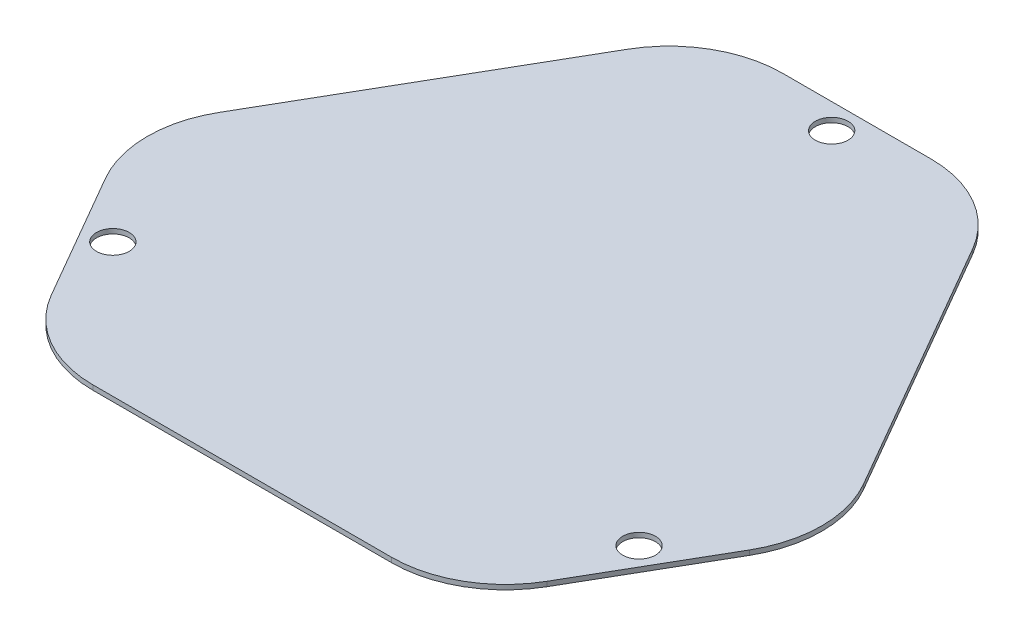
ISO-10303-21;
HEADER;
FILE_DESCRIPTION(('STEP AP214'),'2;1');
FILE_NAME('part.step','',(''),(''),'','','');
FILE_SCHEMA(('AUTOMOTIVE_DESIGN { 1 0 10303 214 1 1 1 1 }'));
ENDSEC;
DATA;
#1=APPLICATION_CONTEXT('core data for automotive mechanical design processes');
#2=APPLICATION_PROTOCOL_DEFINITION('international standard','automotive_design',2000,#1);
#3=PRODUCT_CONTEXT('',#1,'mechanical');
#4=PRODUCT('Part','Part','',(#3));
#5=PRODUCT_RELATED_PRODUCT_CATEGORY('part','',(#4));
#6=PRODUCT_DEFINITION_FORMATION('','',#4);
#7=PRODUCT_DEFINITION_CONTEXT('part definition',#1,'design');
#8=PRODUCT_DEFINITION('design','',#6,#7);
#9=PRODUCT_DEFINITION_SHAPE('','',#8);
#10=(LENGTH_UNIT() NAMED_UNIT(*) SI_UNIT(.MILLI.,.METRE.));
#11=(NAMED_UNIT(*) PLANE_ANGLE_UNIT() SI_UNIT($,.RADIAN.));
#12=(NAMED_UNIT(*) SI_UNIT($,.STERADIAN.) SOLID_ANGLE_UNIT());
#13=UNCERTAINTY_MEASURE_WITH_UNIT(LENGTH_MEASURE(1.E-05),#10,'distance_accuracy_value','');
#14=(GEOMETRIC_REPRESENTATION_CONTEXT(3) GLOBAL_UNCERTAINTY_ASSIGNED_CONTEXT((#13)) GLOBAL_UNIT_ASSIGNED_CONTEXT((#10,
#11,#12)) REPRESENTATION_CONTEXT('',''));
#15=CARTESIAN_POINT('',(0.,0.,0.));
#16=DIRECTION('',(0.,0.,1.));
#17=DIRECTION('',(1.,0.,0.));
#18=AXIS2_PLACEMENT_3D('',#15,#16,#17);
#19=CARTESIAN_POINT('',(0.,6.35,0.));
#20=DIRECTION('',(0.,1.,0.));
#21=DIRECTION('',(0.,0.,1.));
#22=AXIS2_PLACEMENT_3D('',#19,#20,#21);
#23=PLANE('',#22);
#24=CARTESIAN_POINT('',(-2.22133814389154E-13,6.35,-407.190237675492));
#25=DIRECTION('',(0.,1.,0.));
#26=DIRECTION('',(0.,0.,1.));
#27=AXIS2_PLACEMENT_3D('',#24,#25,#26);
#28=CIRCLE('',#27,21.971);
#29=CARTESIAN_POINT('',(-2.22133814389154E-13,6.35,-385.219237675492));
#30=VERTEX_POINT('',#29);
#31=EDGE_CURVE('E388',#30,#30,#28,.T.);
#32=ORIENTED_EDGE('',*,*,#31,.F.);
#33=EDGE_LOOP('',(#32));
#34=FACE_BOUND('',#33,.T.);
#35=CARTESIAN_POINT('',(352.63709,6.35,203.595118837746));
#36=DIRECTION('',(0.,1.,0.));
#37=DIRECTION('',(0.,0.,1.));
#38=AXIS2_PLACEMENT_3D('',#35,#36,#37);
#39=CIRCLE('',#38,21.971);
#40=CARTESIAN_POINT('',(352.63709,6.35,225.566118837746));
#41=VERTEX_POINT('',#40);
#42=EDGE_CURVE('E393',#41,#41,#39,.T.);
#43=ORIENTED_EDGE('',*,*,#42,.F.);
#44=EDGE_LOOP('',(#43));
#45=FACE_BOUND('',#44,.T.);
#46=CARTESIAN_POINT('',(-352.63709,6.35,203.595118837746));
#47=DIRECTION('',(0.,1.,0.));
#48=DIRECTION('',(0.,0.,1.));
#49=AXIS2_PLACEMENT_3D('',#46,#47,#48);
#50=CIRCLE('',#49,21.971);
#51=CARTESIAN_POINT('',(-352.63709,6.35,225.566118837746));
#52=VERTEX_POINT('',#51);
#53=EDGE_CURVE('E402',#52,#52,#50,.T.);
#54=ORIENTED_EDGE('',*,*,#53,.F.);
#55=EDGE_LOOP('',(#54));
#56=FACE_BOUND('',#55,.T.);
#57=DIRECTION('',(0.5,0.,-0.866025403784439));
#58=VECTOR('',#57,1.);
#59=CARTESIAN_POINT('',(229.493160190646,6.35,484.450661911243));
#60=LINE('',#59,#58);
#61=CARTESIAN_POINT('',(332.146038052562,6.35,306.650661911243));
#62=VERTEX_POINT('',#61);
#63=CARTESIAN_POINT('',(431.640282328731,6.35,134.32157576425));
#64=VERTEX_POINT('',#63);
#65=EDGE_CURVE('E134',#62,#64,#60,.T.);
#66=ORIENTED_EDGE('',*,*,#65,.T.);
#67=CARTESIAN_POINT('',(299.658010791982,6.35,58.1215757642498));
#68=DIRECTION('',(0.,1.,0.));
#69=DIRECTION('',(0.,0.,1.));
#70=AXIS2_PLACEMENT_3D('',#67,#68,#69);
#71=CIRCLE('',#70,152.4);
#72=CARTESIAN_POINT('',(431.640282328731,6.35,-18.0784242357502));
#73=VERTEX_POINT('',#72);
#74=EDGE_CURVE('E174',#64,#73,#71,.T.);
#75=ORIENTED_EDGE('',*,*,#74,.T.);
#76=DIRECTION('',(0.5,0.,0.866025403784439));
#77=VECTOR('',#76,1.);
#78=CARTESIAN_POINT('',(475.63437284098,6.35,58.1215757642498));
#79=LINE('',#78,#77);
#80=CARTESIAN_POINT('',(231.476515812917,6.35,-364.772237675493));
#81=VERTEX_POINT('',#80);
#82=EDGE_CURVE('E213',#81,#73,#79,.T.);
#83=ORIENTED_EDGE('',*,*,#82,.F.);
#84=CARTESIAN_POINT('',(99.4942442761689,6.35,-288.572237675493));
#85=DIRECTION('',(0.,1.,0.));
#86=DIRECTION('',(0.,0.,1.));
#87=AXIS2_PLACEMENT_3D('',#84,#85,#86);
#88=CIRCLE('',#87,152.4);
#89=CARTESIAN_POINT('',(99.4942442761689,6.35,-440.972237675493));
#90=VERTEX_POINT('',#89);
#91=EDGE_CURVE('E172',#81,#90,#88,.T.);
#92=ORIENTED_EDGE('',*,*,#91,.T.);
#93=DIRECTION('',(-1.,0.,0.));
#94=VECTOR('',#93,1.);
#95=CARTESIAN_POINT('',(304.8,6.35,-440.972237675493));
#96=LINE('',#95,#94);
#97=CARTESIAN_POINT('',(-99.4942442761688,6.35,-440.972237675493));
#98=VERTEX_POINT('',#97);
#99=EDGE_CURVE('E153',#90,#98,#96,.T.);
#100=ORIENTED_EDGE('',*,*,#99,.T.);
#101=CARTESIAN_POINT('',(-99.4942442761688,6.35,-288.572237675493));
#102=DIRECTION('',(0.,1.,0.));
#103=DIRECTION('',(0.,0.,1.));
#104=AXIS2_PLACEMENT_3D('',#101,#102,#103);
#105=CIRCLE('',#104,152.4);
#106=CARTESIAN_POINT('',(-231.476515812917,6.35,-364.772237675493));
#107=VERTEX_POINT('',#106);
#108=EDGE_CURVE('E170',#98,#107,#105,.T.);
#109=ORIENTED_EDGE('',*,*,#108,.T.);
#110=DIRECTION('',(0.5,0.,-0.866025403784439));
#111=VECTOR('',#110,1.);
#112=CARTESIAN_POINT('',(-187.482425300668,6.35,-440.972237675493));
#113=LINE('',#112,#111);
#114=CARTESIAN_POINT('',(-431.640282328731,6.35,-18.0784242357502));
#115=VERTEX_POINT('',#114);
#116=EDGE_CURVE('E225',#115,#107,#113,.T.);
#117=ORIENTED_EDGE('',*,*,#116,.F.);
#118=CARTESIAN_POINT('',(-299.658010791982,6.35,58.1215757642498));
#119=DIRECTION('',(0.,1.,0.));
#120=DIRECTION('',(0.,0.,1.));
#121=AXIS2_PLACEMENT_3D('',#118,#119,#120);
#122=CIRCLE('',#121,152.4);
#123=CARTESIAN_POINT('',(-431.640282328731,6.35,134.32157576425));
#124=VERTEX_POINT('',#123);
#125=EDGE_CURVE('E142',#115,#124,#122,.T.);
#126=ORIENTED_EDGE('',*,*,#125,.T.);
#127=DIRECTION('',(0.5,0.,0.866025403784439));
#128=VECTOR('',#127,1.);
#129=CARTESIAN_POINT('',(-534.293160190646,6.35,-43.4784242357505));
#130=LINE('',#129,#128);
#131=CARTESIAN_POINT('',(-332.146038052562,6.35,306.650661911243));
#132=VERTEX_POINT('',#131);
#133=EDGE_CURVE('E154',#124,#132,#130,.T.);
#134=ORIENTED_EDGE('',*,*,#133,.T.);
#135=CARTESIAN_POINT('',(-200.163766515813,6.35,230.450661911243));
#136=DIRECTION('',(0.,1.,0.));
#137=DIRECTION('',(0.,0.,1.));
#138=AXIS2_PLACEMENT_3D('',#135,#136,#137);
#139=CIRCLE('',#138,152.4);
#140=CARTESIAN_POINT('',(-200.163766515813,6.35,382.850661911243));
#141=VERTEX_POINT('',#140);
#142=EDGE_CURVE('E141',#132,#141,#139,.T.);
#143=ORIENTED_EDGE('',*,*,#142,.T.);
#144=DIRECTION('',(-1.,0.,0.));
#145=VECTOR('',#144,1.);
#146=CARTESIAN_POINT('',(-288.151947540312,6.35,382.850661911243));
#147=LINE('',#146,#145);
#148=CARTESIAN_POINT('',(200.163766515813,6.35,382.850661911243));
#149=VERTEX_POINT('',#148);
#150=EDGE_CURVE('E136',#149,#141,#147,.T.);
#151=ORIENTED_EDGE('',*,*,#150,.F.);
#152=CARTESIAN_POINT('',(200.163766515813,6.35,230.450661911243));
#153=DIRECTION('',(0.,1.,0.));
#154=DIRECTION('',(0.,0.,1.));
#155=AXIS2_PLACEMENT_3D('',#152,#153,#154);
#156=CIRCLE('',#155,152.4);
#157=EDGE_CURVE('E132',#149,#62,#156,.T.);
#158=ORIENTED_EDGE('',*,*,#157,.T.);
#159=EDGE_LOOP('',(#66,#75,#83,#92,#100,#109,#117,#126,#134,#143,#151,#158));
#160=FACE_BOUND('',#159,.T.);
#161=ADVANCED_FACE('F40',(#34,#45,#56,#160),#23,.T.);
#162=CARTESIAN_POINT('',(0.,0.,0.));
#163=DIRECTION('',(0.,1.,0.));
#164=DIRECTION('',(0.,0.,1.));
#165=AXIS2_PLACEMENT_3D('',#162,#163,#164);
#166=PLANE('',#165);
#167=CARTESIAN_POINT('',(-2.22133814389154E-13,0.,-407.190237675492));
#168=DIRECTION('',(0.,1.,0.));
#169=DIRECTION('',(0.,0.,1.));
#170=AXIS2_PLACEMENT_3D('',#167,#168,#169);
#171=CIRCLE('',#170,21.971);
#172=CARTESIAN_POINT('',(-2.22133814389154E-13,0.,-385.219237675492));
#173=VERTEX_POINT('',#172);
#174=EDGE_CURVE('E218',#173,#173,#171,.T.);
#175=ORIENTED_EDGE('',*,*,#174,.T.);
#176=EDGE_LOOP('',(#175));
#177=FACE_BOUND('',#176,.T.);
#178=CARTESIAN_POINT('',(352.63709,0.,203.595118837746));
#179=DIRECTION('',(0.,1.,0.));
#180=DIRECTION('',(0.,0.,1.));
#181=AXIS2_PLACEMENT_3D('',#178,#179,#180);
#182=CIRCLE('',#181,21.971);
#183=CARTESIAN_POINT('',(352.63709,0.,225.566118837746));
#184=VERTEX_POINT('',#183);
#185=EDGE_CURVE('E389',#184,#184,#182,.T.);
#186=ORIENTED_EDGE('',*,*,#185,.T.);
#187=EDGE_LOOP('',(#186));
#188=FACE_BOUND('',#187,.T.);
#189=CARTESIAN_POINT('',(-352.63709,0.,203.595118837746));
#190=DIRECTION('',(0.,1.,0.));
#191=DIRECTION('',(0.,0.,1.));
#192=AXIS2_PLACEMENT_3D('',#189,#190,#191);
#193=CIRCLE('',#192,21.971);
#194=CARTESIAN_POINT('',(-352.63709,0.,225.566118837746));
#195=VERTEX_POINT('',#194);
#196=EDGE_CURVE('E399',#195,#195,#193,.T.);
#197=ORIENTED_EDGE('',*,*,#196,.T.);
#198=EDGE_LOOP('',(#197));
#199=FACE_BOUND('',#198,.T.);
#200=DIRECTION('',(0.5,0.,0.866025403784439));
#201=VECTOR('',#200,1.);
#202=CARTESIAN_POINT('',(475.63437284098,0.,58.1215757642498));
#203=LINE('',#202,#201);
#204=CARTESIAN_POINT('',(231.476515812917,0.,-364.772237675493));
#205=VERTEX_POINT('',#204);
#206=CARTESIAN_POINT('',(431.640282328731,0.,-18.0784242357502));
#207=VERTEX_POINT('',#206);
#208=EDGE_CURVE('E216',#205,#207,#203,.T.);
#209=ORIENTED_EDGE('',*,*,#208,.T.);
#210=CARTESIAN_POINT('',(299.658010791982,0.,58.1215757642498));
#211=DIRECTION('',(0.,1.,0.));
#212=DIRECTION('',(0.,0.,1.));
#213=AXIS2_PLACEMENT_3D('',#210,#211,#212);
#214=CIRCLE('',#213,152.4);
#215=CARTESIAN_POINT('',(431.640282328731,0.,134.32157576425));
#216=VERTEX_POINT('',#215);
#217=EDGE_CURVE('E190',#207,#216,#214,.F.);
#218=ORIENTED_EDGE('',*,*,#217,.T.);
#219=DIRECTION('',(0.5,0.,-0.866025403784439));
#220=VECTOR('',#219,1.);
#221=CARTESIAN_POINT('',(229.493160190646,0.,484.450661911243));
#222=LINE('',#221,#220);
#223=CARTESIAN_POINT('',(332.146038052562,0.,306.650661911243));
#224=VERTEX_POINT('',#223);
#225=EDGE_CURVE('E231',#224,#216,#222,.T.);
#226=ORIENTED_EDGE('',*,*,#225,.F.);
#227=CARTESIAN_POINT('',(200.163766515813,0.,230.450661911243));
#228=DIRECTION('',(0.,1.,0.));
#229=DIRECTION('',(0.,0.,1.));
#230=AXIS2_PLACEMENT_3D('',#227,#228,#229);
#231=CIRCLE('',#230,152.4);
#232=CARTESIAN_POINT('',(200.163766515813,0.,382.850661911243));
#233=VERTEX_POINT('',#232);
#234=EDGE_CURVE('E158',#224,#233,#231,.F.);
#235=ORIENTED_EDGE('',*,*,#234,.T.);
#236=DIRECTION('',(-1.,0.,0.));
#237=VECTOR('',#236,1.);
#238=CARTESIAN_POINT('',(-288.151947540312,0.,382.850661911243));
#239=LINE('',#238,#237);
#240=CARTESIAN_POINT('',(-200.163766515813,0.,382.850661911243));
#241=VERTEX_POINT('',#240);
#242=EDGE_CURVE('E211',#233,#241,#239,.T.);
#243=ORIENTED_EDGE('',*,*,#242,.T.);
#244=CARTESIAN_POINT('',(-200.163766515813,0.,230.450661911243));
#245=DIRECTION('',(0.,1.,0.));
#246=DIRECTION('',(0.,0.,1.));
#247=AXIS2_PLACEMENT_3D('',#244,#245,#246);
#248=CIRCLE('',#247,152.4);
#249=CARTESIAN_POINT('',(-332.146038052562,0.,306.650661911243));
#250=VERTEX_POINT('',#249);
#251=EDGE_CURVE('E185',#241,#250,#248,.F.);
#252=ORIENTED_EDGE('',*,*,#251,.T.);
#253=DIRECTION('',(0.5,0.,0.866025403784439));
#254=VECTOR('',#253,1.);
#255=CARTESIAN_POINT('',(-534.293160190646,0.,-43.4784242357505));
#256=LINE('',#255,#254);
#257=CARTESIAN_POINT('',(-431.640282328731,0.,134.32157576425));
#258=VERTEX_POINT('',#257);
#259=EDGE_CURVE('E224',#258,#250,#256,.T.);
#260=ORIENTED_EDGE('',*,*,#259,.F.);
#261=CARTESIAN_POINT('',(-299.658010791982,0.,58.1215757642498));
#262=DIRECTION('',(0.,1.,0.));
#263=DIRECTION('',(0.,0.,1.));
#264=AXIS2_PLACEMENT_3D('',#261,#262,#263);
#265=CIRCLE('',#264,152.4);
#266=CARTESIAN_POINT('',(-431.640282328731,0.,-18.0784242357502));
#267=VERTEX_POINT('',#266);
#268=EDGE_CURVE('E182',#258,#267,#265,.F.);
#269=ORIENTED_EDGE('',*,*,#268,.T.);
#270=DIRECTION('',(0.5,0.,-0.866025403784439));
#271=VECTOR('',#270,1.);
#272=CARTESIAN_POINT('',(-187.482425300668,0.,-440.972237675493));
#273=LINE('',#272,#271);
#274=CARTESIAN_POINT('',(-231.476515812917,0.,-364.772237675493));
#275=VERTEX_POINT('',#274);
#276=EDGE_CURVE('E222',#267,#275,#273,.T.);
#277=ORIENTED_EDGE('',*,*,#276,.T.);
#278=CARTESIAN_POINT('',(-99.4942442761688,0.,-288.572237675493));
#279=DIRECTION('',(0.,1.,0.));
#280=DIRECTION('',(0.,0.,1.));
#281=AXIS2_PLACEMENT_3D('',#278,#279,#280);
#282=CIRCLE('',#281,152.4);
#283=CARTESIAN_POINT('',(-99.4942442761688,0.,-440.972237675493));
#284=VERTEX_POINT('',#283);
#285=EDGE_CURVE('E55',#275,#284,#282,.F.);
#286=ORIENTED_EDGE('',*,*,#285,.T.);
#287=DIRECTION('',(-1.,0.,0.));
#288=VECTOR('',#287,1.);
#289=CARTESIAN_POINT('',(304.8,0.,-440.972237675493));
#290=LINE('',#289,#288);
#291=CARTESIAN_POINT('',(99.4942442761689,0.,-440.972237675493));
#292=VERTEX_POINT('',#291);
#293=EDGE_CURVE('E165',#292,#284,#290,.T.);
#294=ORIENTED_EDGE('',*,*,#293,.F.);
#295=CARTESIAN_POINT('',(99.4942442761689,0.,-288.572237675493));
#296=DIRECTION('',(0.,1.,0.));
#297=DIRECTION('',(0.,0.,1.));
#298=AXIS2_PLACEMENT_3D('',#295,#296,#297);
#299=CIRCLE('',#298,152.4);
#300=EDGE_CURVE('E188',#292,#205,#299,.F.);
#301=ORIENTED_EDGE('',*,*,#300,.T.);
#302=EDGE_LOOP('',(#209,#218,#226,#235,#243,#252,#260,#269,#277,#286,#294,#301));
#303=FACE_BOUND('',#302,.T.);
#304=ADVANCED_FACE('F256',(#177,#188,#199,#303),#166,.F.);
#305=CARTESIAN_POINT('',(-534.293160190646,6.35,-43.4784242357505));
#306=DIRECTION('',(0.866025403784439,0.,-0.5));
#307=DIRECTION('',(-0.5,0.,-0.866025403784439));
#308=AXIS2_PLACEMENT_3D('',#305,#306,#307);
#309=PLANE('',#308);
#310=ORIENTED_EDGE('',*,*,#259,.T.);
#311=DIRECTION('',(0.,1.,0.));
#312=VECTOR('',#311,1.);
#313=CARTESIAN_POINT('',(-332.146038052562,6.35,306.650661911243));
#314=LINE('',#313,#312);
#315=EDGE_CURVE('E204',#250,#132,#314,.T.);
#316=ORIENTED_EDGE('',*,*,#315,.T.);
#317=ORIENTED_EDGE('',*,*,#133,.F.);
#318=DIRECTION('',(0.,1.,0.));
#319=VECTOR('',#318,1.);
#320=CARTESIAN_POINT('',(-431.640282328731,6.35,134.32157576425));
#321=LINE('',#320,#319);
#322=EDGE_CURVE('E202',#124,#258,#321,.F.);
#323=ORIENTED_EDGE('',*,*,#322,.T.);
#324=EDGE_LOOP('',(#310,#316,#317,#323));
#325=FACE_BOUND('',#324,.T.);
#326=ADVANCED_FACE('F250',(#325),#309,.F.);
#327=CARTESIAN_POINT('',(229.493160190646,6.35,484.450661911243));
#328=DIRECTION('',(-0.866025403784439,0.,-0.5));
#329=DIRECTION('',(-0.5,0.,0.866025403784439));
#330=AXIS2_PLACEMENT_3D('',#327,#328,#329);
#331=PLANE('',#330);
#332=ORIENTED_EDGE('',*,*,#225,.T.);
#333=DIRECTION('',(0.,1.,0.));
#334=VECTOR('',#333,1.);
#335=CARTESIAN_POINT('',(431.640282328731,6.35,134.32157576425));
#336=LINE('',#335,#334);
#337=EDGE_CURVE('E151',#216,#64,#336,.T.);
#338=ORIENTED_EDGE('',*,*,#337,.T.);
#339=ORIENTED_EDGE('',*,*,#65,.F.);
#340=DIRECTION('',(0.,1.,0.));
#341=VECTOR('',#340,1.);
#342=CARTESIAN_POINT('',(332.146038052562,6.35,306.650661911243));
#343=LINE('',#342,#341);
#344=EDGE_CURVE('E148',#62,#224,#343,.F.);
#345=ORIENTED_EDGE('',*,*,#344,.T.);
#346=EDGE_LOOP('',(#332,#338,#339,#345));
#347=FACE_BOUND('',#346,.T.);
#348=ADVANCED_FACE('F147',(#347),#331,.F.);
#349=CARTESIAN_POINT('',(304.8,6.35,-440.972237675493));
#350=DIRECTION('',(0.,0.,1.));
#351=DIRECTION('',(1.,0.,0.));
#352=AXIS2_PLACEMENT_3D('',#349,#350,#351);
#353=PLANE('',#352);
#354=ORIENTED_EDGE('',*,*,#99,.F.);
#355=DIRECTION('',(0.,1.,0.));
#356=VECTOR('',#355,1.);
#357=CARTESIAN_POINT('',(99.4942442761689,6.35,-440.972237675493));
#358=LINE('',#357,#356);
#359=EDGE_CURVE('E62',#90,#292,#358,.F.);
#360=ORIENTED_EDGE('',*,*,#359,.T.);
#361=ORIENTED_EDGE('',*,*,#293,.T.);
#362=DIRECTION('',(0.,1.,0.));
#363=VECTOR('',#362,1.);
#364=CARTESIAN_POINT('',(-99.4942442761688,6.35,-440.972237675493));
#365=LINE('',#364,#363);
#366=EDGE_CURVE('E193',#284,#98,#365,.T.);
#367=ORIENTED_EDGE('',*,*,#366,.T.);
#368=EDGE_LOOP('',(#354,#360,#361,#367));
#369=FACE_BOUND('',#368,.T.);
#370=ADVANCED_FACE('F235',(#369),#353,.F.);
#371=CARTESIAN_POINT('',(-187.482425300668,0.,-440.972237675493));
#372=DIRECTION('',(0.866025403784439,0.,0.5));
#373=DIRECTION('',(0.5,0.,-0.866025403784439));
#374=AXIS2_PLACEMENT_3D('',#371,#372,#373);
#375=PLANE('',#374);
#376=ORIENTED_EDGE('',*,*,#116,.T.);
#377=DIRECTION('',(0.,1.,0.));
#378=VECTOR('',#377,1.);
#379=CARTESIAN_POINT('',(-231.476515812917,0.,-364.772237675493));
#380=LINE('',#379,#378);
#381=EDGE_CURVE('E200',#107,#275,#380,.F.);
#382=ORIENTED_EDGE('',*,*,#381,.T.);
#383=ORIENTED_EDGE('',*,*,#276,.F.);
#384=DIRECTION('',(0.,1.,0.));
#385=VECTOR('',#384,1.);
#386=CARTESIAN_POINT('',(-431.640282328731,0.,-18.0784242357501));
#387=LINE('',#386,#385);
#388=EDGE_CURVE('E197',#267,#115,#387,.T.);
#389=ORIENTED_EDGE('',*,*,#388,.T.);
#390=EDGE_LOOP('',(#376,#382,#383,#389));
#391=FACE_BOUND('',#390,.T.);
#392=ADVANCED_FACE('F242',(#391),#375,.F.);
#393=CARTESIAN_POINT('',(475.63437284098,0.,58.1215757642498));
#394=DIRECTION('',(-0.866025403784438,0.,0.5));
#395=DIRECTION('',(0.5,0.,0.866025403784439));
#396=AXIS2_PLACEMENT_3D('',#393,#394,#395);
#397=PLANE('',#396);
#398=ORIENTED_EDGE('',*,*,#82,.T.);
#399=DIRECTION('',(0.,1.,0.));
#400=VECTOR('',#399,1.);
#401=CARTESIAN_POINT('',(431.640282328731,0.,-18.0784242357502));
#402=LINE('',#401,#400);
#403=EDGE_CURVE('E180',#73,#207,#402,.F.);
#404=ORIENTED_EDGE('',*,*,#403,.T.);
#405=ORIENTED_EDGE('',*,*,#208,.F.);
#406=DIRECTION('',(0.,1.,0.));
#407=VECTOR('',#406,1.);
#408=CARTESIAN_POINT('',(231.476515812917,0.,-364.772237675493));
#409=LINE('',#408,#407);
#410=EDGE_CURVE('E177',#205,#81,#409,.T.);
#411=ORIENTED_EDGE('',*,*,#410,.T.);
#412=EDGE_LOOP('',(#398,#404,#405,#411));
#413=FACE_BOUND('',#412,.T.);
#414=ADVANCED_FACE('F309',(#413),#397,.F.);
#415=CARTESIAN_POINT('',(-288.151947540312,0.,382.850661911243));
#416=DIRECTION('',(0.,0.,-1.));
#417=DIRECTION('',(-1.,0.,0.));
#418=AXIS2_PLACEMENT_3D('',#415,#416,#417);
#419=PLANE('',#418);
#420=ORIENTED_EDGE('',*,*,#150,.T.);
#421=DIRECTION('',(0.,1.,0.));
#422=VECTOR('',#421,1.);
#423=CARTESIAN_POINT('',(-200.163766515813,0.,382.850661911243));
#424=LINE('',#423,#422);
#425=EDGE_CURVE('E11',#141,#241,#424,.F.);
#426=ORIENTED_EDGE('',*,*,#425,.T.);
#427=ORIENTED_EDGE('',*,*,#242,.F.);
#428=DIRECTION('',(0.,1.,0.));
#429=VECTOR('',#428,1.);
#430=CARTESIAN_POINT('',(200.163766515813,0.,382.850661911243));
#431=LINE('',#430,#429);
#432=EDGE_CURVE('E48',#233,#149,#431,.T.);
#433=ORIENTED_EDGE('',*,*,#432,.T.);
#434=EDGE_LOOP('',(#420,#426,#427,#433));
#435=FACE_BOUND('',#434,.T.);
#436=ADVANCED_FACE('F208',(#435),#419,.F.);
#437=CARTESIAN_POINT('',(299.658010791982,6.35,58.1215757642498));
#438=DIRECTION('',(0.,1.,0.));
#439=DIRECTION('',(0.,0.,1.));
#440=AXIS2_PLACEMENT_3D('',#437,#438,#439);
#441=CYLINDRICAL_SURFACE('',#440,152.4);
#442=ORIENTED_EDGE('',*,*,#217,.F.);
#443=ORIENTED_EDGE('',*,*,#403,.F.);
#444=ORIENTED_EDGE('',*,*,#74,.F.);
#445=ORIENTED_EDGE('',*,*,#337,.F.);
#446=EDGE_LOOP('',(#442,#443,#444,#445));
#447=FACE_BOUND('',#446,.T.);
#448=ADVANCED_FACE('F277',(#447),#441,.T.);
#449=CARTESIAN_POINT('',(99.4942442761689,0.,-288.572237675493));
#450=DIRECTION('',(0.,1.,0.));
#451=DIRECTION('',(0.,0.,1.));
#452=AXIS2_PLACEMENT_3D('',#449,#450,#451);
#453=CYLINDRICAL_SURFACE('',#452,152.4);
#454=ORIENTED_EDGE('',*,*,#300,.F.);
#455=ORIENTED_EDGE('',*,*,#359,.F.);
#456=ORIENTED_EDGE('',*,*,#91,.F.);
#457=ORIENTED_EDGE('',*,*,#410,.F.);
#458=EDGE_LOOP('',(#454,#455,#456,#457));
#459=FACE_BOUND('',#458,.T.);
#460=ADVANCED_FACE('F280',(#459),#453,.T.);
#461=CARTESIAN_POINT('',(-99.4942442761688,6.35,-288.572237675493));
#462=DIRECTION('',(0.,1.,0.));
#463=DIRECTION('',(0.,0.,1.));
#464=AXIS2_PLACEMENT_3D('',#461,#462,#463);
#465=CYLINDRICAL_SURFACE('',#464,152.4);
#466=ORIENTED_EDGE('',*,*,#285,.F.);
#467=ORIENTED_EDGE('',*,*,#381,.F.);
#468=ORIENTED_EDGE('',*,*,#108,.F.);
#469=ORIENTED_EDGE('',*,*,#366,.F.);
#470=EDGE_LOOP('',(#466,#467,#468,#469));
#471=FACE_BOUND('',#470,.T.);
#472=ADVANCED_FACE('F238',(#471),#465,.T.);
#473=CARTESIAN_POINT('',(-200.163766515813,6.35,230.450661911243));
#474=DIRECTION('',(0.,1.,0.));
#475=DIRECTION('',(0.,0.,1.));
#476=AXIS2_PLACEMENT_3D('',#473,#474,#475);
#477=CYLINDRICAL_SURFACE('',#476,152.4);
#478=ORIENTED_EDGE('',*,*,#251,.F.);
#479=ORIENTED_EDGE('',*,*,#425,.F.);
#480=ORIENTED_EDGE('',*,*,#142,.F.);
#481=ORIENTED_EDGE('',*,*,#315,.F.);
#482=EDGE_LOOP('',(#478,#479,#480,#481));
#483=FACE_BOUND('',#482,.T.);
#484=ADVANCED_FACE('F254',(#483),#477,.T.);
#485=CARTESIAN_POINT('',(200.163766515813,0.,230.450661911243));
#486=DIRECTION('',(0.,1.,0.));
#487=DIRECTION('',(0.,0.,1.));
#488=AXIS2_PLACEMENT_3D('',#485,#486,#487);
#489=CYLINDRICAL_SURFACE('',#488,152.4);
#490=ORIENTED_EDGE('',*,*,#234,.F.);
#491=ORIENTED_EDGE('',*,*,#344,.F.);
#492=ORIENTED_EDGE('',*,*,#157,.F.);
#493=ORIENTED_EDGE('',*,*,#432,.F.);
#494=EDGE_LOOP('',(#490,#491,#492,#493));
#495=FACE_BOUND('',#494,.T.);
#496=ADVANCED_FACE('F157',(#495),#489,.T.);
#497=CARTESIAN_POINT('',(-299.658010791982,0.,58.1215757642498));
#498=DIRECTION('',(0.,1.,0.));
#499=DIRECTION('',(0.,0.,1.));
#500=AXIS2_PLACEMENT_3D('',#497,#498,#499);
#501=CYLINDRICAL_SURFACE('',#500,152.4);
#502=ORIENTED_EDGE('',*,*,#268,.F.);
#503=ORIENTED_EDGE('',*,*,#322,.F.);
#504=ORIENTED_EDGE('',*,*,#125,.F.);
#505=ORIENTED_EDGE('',*,*,#388,.F.);
#506=EDGE_LOOP('',(#502,#503,#504,#505));
#507=FACE_BOUND('',#506,.T.);
#508=ADVANCED_FACE('F42',(#507),#501,.T.);
#509=CARTESIAN_POINT('',(-352.63709,0.,203.595118837746));
#510=DIRECTION('',(0.,1.,0.));
#511=DIRECTION('',(0.,0.,1.));
#512=AXIS2_PLACEMENT_3D('',#509,#510,#511);
#513=CYLINDRICAL_SURFACE('',#512,21.971);
#514=ORIENTED_EDGE('',*,*,#196,.F.);
#515=EDGE_LOOP('',(#514));
#516=FACE_BOUND('',#515,.T.);
#517=ORIENTED_EDGE('',*,*,#53,.T.);
#518=EDGE_LOOP('',(#517));
#519=FACE_BOUND('',#518,.T.);
#520=ADVANCED_FACE('F292',(#516,#519),#513,.F.);
#521=CARTESIAN_POINT('',(352.63709,0.,203.595118837746));
#522=DIRECTION('',(0.,1.,0.));
#523=DIRECTION('',(0.,0.,1.));
#524=AXIS2_PLACEMENT_3D('',#521,#522,#523);
#525=CYLINDRICAL_SURFACE('',#524,21.971);
#526=ORIENTED_EDGE('',*,*,#185,.F.);
#527=EDGE_LOOP('',(#526));
#528=FACE_BOUND('',#527,.T.);
#529=ORIENTED_EDGE('',*,*,#42,.T.);
#530=EDGE_LOOP('',(#529));
#531=FACE_BOUND('',#530,.T.);
#532=ADVANCED_FACE('F296',(#528,#531),#525,.F.);
#533=CARTESIAN_POINT('',(-2.22133814389154E-13,0.,-407.190237675492));
#534=DIRECTION('',(0.,1.,0.));
#535=DIRECTION('',(0.,0.,1.));
#536=AXIS2_PLACEMENT_3D('',#533,#534,#535);
#537=CYLINDRICAL_SURFACE('',#536,21.971);
#538=ORIENTED_EDGE('',*,*,#174,.F.);
#539=EDGE_LOOP('',(#538));
#540=FACE_BOUND('',#539,.T.);
#541=ORIENTED_EDGE('',*,*,#31,.T.);
#542=EDGE_LOOP('',(#541));
#543=FACE_BOUND('',#542,.T.);
#544=ADVANCED_FACE('F302',(#540,#543),#537,.F.);
#545=CLOSED_SHELL('',(#161,#304,#326,#348,#370,#392,#414,#436,#448,#460,#472,#484,#496,#508,
#520,#532,#544));
#546=MANIFOLD_SOLID_BREP('B2',#545);
#547=ADVANCED_BREP_SHAPE_REPRESENTATION('',(#18,#546),#14);
#548=SHAPE_DEFINITION_REPRESENTATION(#9,#547);
ENDSEC;
END-ISO-10303-21;
